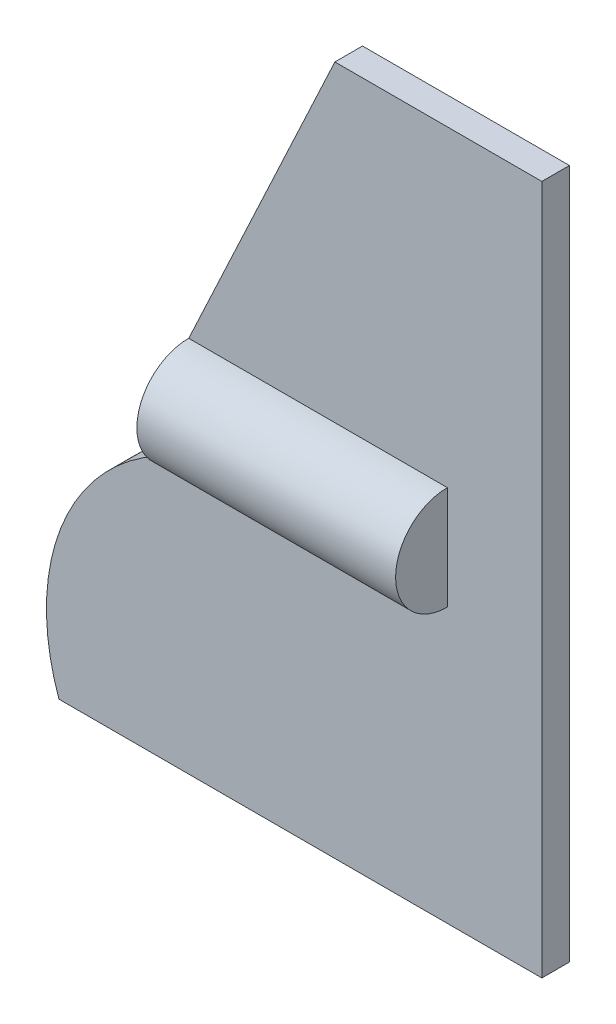
ISO-10303-21;
HEADER;
FILE_DESCRIPTION(('STEP AP214'),'2;1');
FILE_NAME('part.step','',(''),(''),'','','');
FILE_SCHEMA(('AUTOMOTIVE_DESIGN { 1 0 10303 214 1 1 1 1 }'));
ENDSEC;
DATA;
#1=APPLICATION_CONTEXT('core data for automotive mechanical design processes');
#2=APPLICATION_PROTOCOL_DEFINITION('international standard','automotive_design',2000,#1);
#3=PRODUCT_CONTEXT('',#1,'mechanical');
#4=PRODUCT('Part','Part','',(#3));
#5=PRODUCT_RELATED_PRODUCT_CATEGORY('part','',(#4));
#6=PRODUCT_DEFINITION_FORMATION('','',#4);
#7=PRODUCT_DEFINITION_CONTEXT('part definition',#1,'design');
#8=PRODUCT_DEFINITION('design','',#6,#7);
#9=PRODUCT_DEFINITION_SHAPE('','',#8);
#10=(LENGTH_UNIT() NAMED_UNIT(*) SI_UNIT(.MILLI.,.METRE.));
#11=(NAMED_UNIT(*) PLANE_ANGLE_UNIT() SI_UNIT($,.RADIAN.));
#12=(NAMED_UNIT(*) SI_UNIT($,.STERADIAN.) SOLID_ANGLE_UNIT());
#13=UNCERTAINTY_MEASURE_WITH_UNIT(LENGTH_MEASURE(1.E-05),#10,'distance_accuracy_value','');
#14=(GEOMETRIC_REPRESENTATION_CONTEXT(3) GLOBAL_UNCERTAINTY_ASSIGNED_CONTEXT((#13)) GLOBAL_UNIT_ASSIGNED_CONTEXT((#10,
#11,#12)) REPRESENTATION_CONTEXT('',''));
#15=CARTESIAN_POINT('',(0.,0.,0.));
#16=DIRECTION('',(0.,0.,1.));
#17=DIRECTION('',(1.,0.,0.));
#18=AXIS2_PLACEMENT_3D('',#15,#16,#17);
#19=CARTESIAN_POINT('',(56.3,54.7109107507036,4.));
#20=DIRECTION('',(0.,0.,1.));
#21=DIRECTION('',(1.,0.,0.));
#22=AXIS2_PLACEMENT_3D('',#19,#20,#21);
#23=PLANE('',#22);
#24=DIRECTION('',(-1.,0.,0.));
#25=VECTOR('',#24,1.);
#26=CARTESIAN_POINT('',(48.8,51.9164148444315,4.));
#27=LINE('',#26,#25);
#28=CARTESIAN_POINT('',(18.8,51.9164148444315,4.));
#29=VERTEX_POINT('',#28);
#30=CARTESIAN_POINT('',(18.8127775541657,51.9164148444315,4.));
#31=VERTEX_POINT('',#30);
#32=EDGE_CURVE('E118',#29,#31,#27,.F.);
#33=ORIENTED_EDGE('',*,*,#32,.F.);
#34=DIRECTION('',(0.,1.,0.));
#35=VECTOR('',#34,1.);
#36=CARTESIAN_POINT('',(18.8,54.7109107507036,4.));
#37=LINE('',#36,#35);
#38=CARTESIAN_POINT('',(18.8,54.7109107507036,4.));
#39=VERTEX_POINT('',#38);
#40=EDGE_CURVE('E130',#29,#39,#37,.T.);
#41=ORIENTED_EDGE('',*,*,#40,.T.);
#42=DIRECTION('',(-1.,0.,0.));
#43=VECTOR('',#42,1.);
#44=CARTESIAN_POINT('',(56.3,54.7109107507036,4.));
#45=LINE('',#44,#43);
#46=CARTESIAN_POINT('',(18.8127775541658,54.7109107507036,4.));
#47=VERTEX_POINT('',#46);
#48=EDGE_CURVE('E155',#47,#39,#45,.T.);
#49=ORIENTED_EDGE('',*,*,#48,.F.);
#50=DIRECTION('',(0.,-1.,0.));
#51=VECTOR('',#50,1.);
#52=CARTESIAN_POINT('',(18.8127775541658,54.7109107507036,4.));
#53=LINE('',#52,#51);
#54=EDGE_CURVE('E133',#47,#31,#53,.T.);
#55=ORIENTED_EDGE('',*,*,#54,.T.);
#56=EDGE_LOOP('',(#33,#41,#49,#55));
#57=FACE_BOUND('',#56,.T.);
#58=ADVANCED_FACE('F39',(#57),#23,.F.);
#59=DIRECTION('',(-1.,0.,0.));
#60=VECTOR('',#59,1.);
#61=CARTESIAN_POINT('',(48.8,42.5054066569756,4.));
#62=LINE('',#61,#60);
#63=CARTESIAN_POINT('',(18.8127775541657,42.5054066569756,4.));
#64=VERTEX_POINT('',#63);
#65=CARTESIAN_POINT('',(18.8,42.5054066569756,4.));
#66=VERTEX_POINT('',#65);
#67=EDGE_CURVE('E55',#64,#66,#62,.T.);
#68=ORIENTED_EDGE('',*,*,#67,.F.);
#69=CARTESIAN_POINT('',(18.8127775541657,39.7109107507036,4.));
#70=VERTEX_POINT('',#69);
#71=EDGE_CURVE('E177',#64,#70,#53,.T.);
#72=ORIENTED_EDGE('',*,*,#71,.T.);
#73=DIRECTION('',(-1.,0.,0.));
#74=VECTOR('',#73,1.);
#75=CARTESIAN_POINT('',(56.3,39.7109107507036,4.));
#76=LINE('',#75,#74);
#77=CARTESIAN_POINT('',(18.8,39.7109107507036,4.));
#78=VERTEX_POINT('',#77);
#79=EDGE_CURVE('E154',#70,#78,#76,.T.);
#80=ORIENTED_EDGE('',*,*,#79,.T.);
#81=EDGE_CURVE('E142',#78,#66,#37,.T.);
#82=ORIENTED_EDGE('',*,*,#81,.T.);
#83=EDGE_LOOP('',(#68,#72,#80,#82));
#84=FACE_BOUND('',#83,.T.);
#85=ADVANCED_FACE('F272',(#84),#23,.F.);
#86=CARTESIAN_POINT('',(29.2618441524348,10.4490665982689,4.));
#87=DIRECTION('',(0.,0.,1.));
#88=DIRECTION('',(1.,0.,0.));
#89=AXIS2_PLACEMENT_3D('',#86,#87,#88);
#90=PLANE('',#89);
#91=DIRECTION('',(-0.423744448916685,-0.905781784985928,0.));
#92=VECTOR('',#91,1.);
#93=CARTESIAN_POINT('',(40.,100.,4.));
#94=LINE('',#93,#92);
#95=CARTESIAN_POINT('',(40.,100.,4.));
#96=VERTEX_POINT('',#95);
#97=EDGE_CURVE('E174',#96,#47,#94,.T.);
#98=ORIENTED_EDGE('',*,*,#97,.T.);
#99=CARTESIAN_POINT('',(56.3,54.7109107507036,4.));
#100=VERTEX_POINT('',#99);
#101=EDGE_CURVE('E150',#100,#47,#45,.T.);
#102=ORIENTED_EDGE('',*,*,#101,.F.);
#103=DIRECTION('',(0.,1.,0.));
#104=VECTOR('',#103,1.);
#105=CARTESIAN_POINT('',(56.3,54.7109107507036,4.));
#106=LINE('',#105,#104);
#107=CARTESIAN_POINT('',(56.3,39.7109107507036,4.));
#108=VERTEX_POINT('',#107);
#109=EDGE_CURVE('E63',#108,#100,#106,.T.);
#110=ORIENTED_EDGE('',*,*,#109,.F.);
#111=EDGE_CURVE('E156',#108,#70,#76,.T.);
#112=ORIENTED_EDGE('',*,*,#111,.T.);
#113=CARTESIAN_POINT('',(29.2618441524348,10.4490665982689,4.));
#114=DIRECTION('',(0.,0.,1.));
#115=DIRECTION('',(1.,0.,0.));
#116=AXIS2_PLACEMENT_3D('',#113,#114,#115);
#117=CIRCLE('',#116,31.0715064967317);
#118=CARTESIAN_POINT('',(0.,0.,4.));
#119=VERTEX_POINT('',#118);
#120=EDGE_CURVE('E160',#70,#119,#117,.T.);
#121=ORIENTED_EDGE('',*,*,#120,.T.);
#122=DIRECTION('',(1.,0.,0.));
#123=VECTOR('',#122,1.);
#124=CARTESIAN_POINT('',(0.,0.,4.));
#125=LINE('',#124,#123);
#126=CARTESIAN_POINT('',(70.,0.,4.));
#127=VERTEX_POINT('',#126);
#128=EDGE_CURVE('E164',#119,#127,#125,.T.);
#129=ORIENTED_EDGE('',*,*,#128,.T.);
#130=DIRECTION('',(0.,1.,0.));
#131=VECTOR('',#130,1.);
#132=CARTESIAN_POINT('',(70.,0.,4.));
#133=LINE('',#132,#131);
#134=CARTESIAN_POINT('',(70.,100.,4.));
#135=VERTEX_POINT('',#134);
#136=EDGE_CURVE('E168',#127,#135,#133,.T.);
#137=ORIENTED_EDGE('',*,*,#136,.T.);
#138=DIRECTION('',(-1.,0.,0.));
#139=VECTOR('',#138,1.);
#140=CARTESIAN_POINT('',(70.,100.,4.));
#141=LINE('',#140,#139);
#142=EDGE_CURVE('E171',#135,#96,#141,.T.);
#143=ORIENTED_EDGE('',*,*,#142,.T.);
#144=EDGE_LOOP('',(#98,#102,#110,#112,#121,#129,#137,#143));
#145=FACE_BOUND('',#144,.T.);
#146=ADVANCED_FACE('F235',(#145),#90,.T.);
#147=CARTESIAN_POINT('',(29.2618441524348,10.4490665982689,4.));
#148=DIRECTION('',(0.,0.,-1.));
#149=DIRECTION('',(-1.,0.,0.));
#150=AXIS2_PLACEMENT_3D('',#147,#148,#149);
#151=CYLINDRICAL_SURFACE('',#150,31.0715064967317);
#152=CARTESIAN_POINT('',(29.2618441524348,10.4490665982689,0.));
#153=DIRECTION('',(0.,0.,1.));
#154=DIRECTION('',(1.,0.,0.));
#155=AXIS2_PLACEMENT_3D('',#152,#153,#154);
#156=CIRCLE('',#155,31.0715064967317);
#157=CARTESIAN_POINT('',(18.8127775541657,39.7109107507036,0.));
#158=VERTEX_POINT('',#157);
#159=CARTESIAN_POINT('',(0.,0.,0.));
#160=VERTEX_POINT('',#159);
#161=EDGE_CURVE('E159',#158,#160,#156,.T.);
#162=ORIENTED_EDGE('',*,*,#161,.T.);
#163=DIRECTION('',(0.,0.,-1.));
#164=VECTOR('',#163,1.);
#165=CARTESIAN_POINT('',(0.,0.,4.));
#166=LINE('',#165,#164);
#167=EDGE_CURVE('E11',#119,#160,#166,.T.);
#168=ORIENTED_EDGE('',*,*,#167,.F.);
#169=ORIENTED_EDGE('',*,*,#120,.F.);
#170=DIRECTION('',(0.,0.,-1.));
#171=VECTOR('',#170,1.);
#172=CARTESIAN_POINT('',(18.8127775541657,39.7109107507036,4.));
#173=LINE('',#172,#171);
#174=EDGE_CURVE('E180',#70,#158,#173,.T.);
#175=ORIENTED_EDGE('',*,*,#174,.T.);
#176=EDGE_LOOP('',(#162,#168,#169,#175));
#177=FACE_BOUND('',#176,.T.);
#178=ADVANCED_FACE('F41',(#177),#151,.T.);
#179=CARTESIAN_POINT('',(0.,0.,4.));
#180=DIRECTION('',(0.,1.,0.));
#181=DIRECTION('',(0.,0.,1.));
#182=AXIS2_PLACEMENT_3D('',#179,#180,#181);
#183=PLANE('',#182);
#184=DIRECTION('',(1.,0.,0.));
#185=VECTOR('',#184,1.);
#186=CARTESIAN_POINT('',(0.,0.,0.));
#187=LINE('',#186,#185);
#188=CARTESIAN_POINT('',(70.,0.,0.));
#189=VERTEX_POINT('',#188);
#190=EDGE_CURVE('E184',#160,#189,#187,.T.);
#191=ORIENTED_EDGE('',*,*,#190,.T.);
#192=DIRECTION('',(0.,0.,-1.));
#193=VECTOR('',#192,1.);
#194=CARTESIAN_POINT('',(70.,0.,4.));
#195=LINE('',#194,#193);
#196=EDGE_CURVE('E48',#127,#189,#195,.T.);
#197=ORIENTED_EDGE('',*,*,#196,.F.);
#198=ORIENTED_EDGE('',*,*,#128,.F.);
#199=ORIENTED_EDGE('',*,*,#167,.T.);
#200=EDGE_LOOP('',(#191,#197,#198,#199));
#201=FACE_BOUND('',#200,.T.);
#202=ADVANCED_FACE('F238',(#201),#183,.F.);
#203=CARTESIAN_POINT('',(70.,0.,4.));
#204=DIRECTION('',(-1.,0.,0.));
#205=DIRECTION('',(0.,0.,1.));
#206=AXIS2_PLACEMENT_3D('',#203,#204,#205);
#207=PLANE('',#206);
#208=DIRECTION('',(0.,1.,0.));
#209=VECTOR('',#208,1.);
#210=CARTESIAN_POINT('',(70.,0.,0.));
#211=LINE('',#210,#209);
#212=CARTESIAN_POINT('',(70.,100.,0.));
#213=VERTEX_POINT('',#212);
#214=EDGE_CURVE('E187',#189,#213,#211,.T.);
#215=ORIENTED_EDGE('',*,*,#214,.T.);
#216=DIRECTION('',(0.,0.,-1.));
#217=VECTOR('',#216,1.);
#218=CARTESIAN_POINT('',(70.,100.,4.));
#219=LINE('',#218,#217);
#220=EDGE_CURVE('E209',#135,#213,#219,.T.);
#221=ORIENTED_EDGE('',*,*,#220,.F.);
#222=ORIENTED_EDGE('',*,*,#136,.F.);
#223=ORIENTED_EDGE('',*,*,#196,.T.);
#224=EDGE_LOOP('',(#215,#221,#222,#223));
#225=FACE_BOUND('',#224,.T.);
#226=ADVANCED_FACE('F218',(#225),#207,.F.);
#227=CARTESIAN_POINT('',(70.,100.,4.));
#228=DIRECTION('',(0.,-1.,0.));
#229=DIRECTION('',(0.,0.,-1.));
#230=AXIS2_PLACEMENT_3D('',#227,#228,#229);
#231=PLANE('',#230);
#232=DIRECTION('',(-1.,0.,0.));
#233=VECTOR('',#232,1.);
#234=CARTESIAN_POINT('',(70.,100.,0.));
#235=LINE('',#234,#233);
#236=CARTESIAN_POINT('',(40.,100.,0.));
#237=VERTEX_POINT('',#236);
#238=EDGE_CURVE('E190',#213,#237,#235,.T.);
#239=ORIENTED_EDGE('',*,*,#238,.T.);
#240=DIRECTION('',(0.,0.,-1.));
#241=VECTOR('',#240,1.);
#242=CARTESIAN_POINT('',(40.,100.,4.));
#243=LINE('',#242,#241);
#244=EDGE_CURVE('E205',#96,#237,#243,.T.);
#245=ORIENTED_EDGE('',*,*,#244,.F.);
#246=ORIENTED_EDGE('',*,*,#142,.F.);
#247=ORIENTED_EDGE('',*,*,#220,.T.);
#248=EDGE_LOOP('',(#239,#245,#246,#247));
#249=FACE_BOUND('',#248,.T.);
#250=ADVANCED_FACE('F229',(#249),#231,.F.);
#251=CARTESIAN_POINT('',(40.,100.,4.));
#252=DIRECTION('',(0.905781784985929,-0.423744448916685,0.));
#253=DIRECTION('',(0.423744448916685,0.905781784985928,0.));
#254=AXIS2_PLACEMENT_3D('',#251,#252,#253);
#255=PLANE('',#254);
#256=DIRECTION('',(-0.423744448916685,-0.905781784985928,0.));
#257=VECTOR('',#256,1.);
#258=CARTESIAN_POINT('',(40.,100.,0.));
#259=LINE('',#258,#257);
#260=CARTESIAN_POINT('',(18.8127775541658,54.7109107507036,0.));
#261=VERTEX_POINT('',#260);
#262=EDGE_CURVE('E193',#237,#261,#259,.T.);
#263=ORIENTED_EDGE('',*,*,#262,.T.);
#264=DIRECTION('',(0.,0.,-1.));
#265=VECTOR('',#264,1.);
#266=CARTESIAN_POINT('',(18.8127775541658,54.7109107507036,4.));
#267=LINE('',#266,#265);
#268=EDGE_CURVE('E201',#47,#261,#267,.T.);
#269=ORIENTED_EDGE('',*,*,#268,.F.);
#270=ORIENTED_EDGE('',*,*,#97,.F.);
#271=ORIENTED_EDGE('',*,*,#244,.T.);
#272=EDGE_LOOP('',(#263,#269,#270,#271));
#273=FACE_BOUND('',#272,.T.);
#274=ADVANCED_FACE('F233',(#273),#255,.F.);
#275=CARTESIAN_POINT('',(18.8127775541658,54.7109107507036,4.));
#276=DIRECTION('',(1.,0.,0.));
#277=DIRECTION('',(0.,1.,0.));
#278=AXIS2_PLACEMENT_3D('',#275,#276,#277);
#279=PLANE('',#278);
#280=CARTESIAN_POINT('',(18.8127775541657,47.2109107507036,5.69063042203477));
#281=DIRECTION('',(1.,0.,0.));
#282=DIRECTION('',(0.,1.,0.));
#283=AXIS2_PLACEMENT_3D('',#280,#281,#282);
#284=CIRCLE('',#283,5.);
#285=EDGE_CURVE('E136',#31,#64,#284,.F.);
#286=ORIENTED_EDGE('',*,*,#285,.F.);
#287=ORIENTED_EDGE('',*,*,#54,.F.);
#288=ORIENTED_EDGE('',*,*,#268,.T.);
#289=DIRECTION('',(0.,-1.,0.));
#290=VECTOR('',#289,1.);
#291=CARTESIAN_POINT('',(18.8127775541658,54.7109107507036,0.));
#292=LINE('',#291,#290);
#293=EDGE_CURVE('E165',#261,#158,#292,.T.);
#294=ORIENTED_EDGE('',*,*,#293,.T.);
#295=ORIENTED_EDGE('',*,*,#174,.F.);
#296=ORIENTED_EDGE('',*,*,#71,.F.);
#297=EDGE_LOOP('',(#286,#287,#288,#294,#295,#296));
#298=FACE_BOUND('',#297,.T.);
#299=ADVANCED_FACE('F242',(#298),#279,.F.);
#300=CARTESIAN_POINT('',(29.2618441524348,10.4490665982689,0.));
#301=DIRECTION('',(0.,0.,1.));
#302=DIRECTION('',(1.,0.,0.));
#303=AXIS2_PLACEMENT_3D('',#300,#301,#302);
#304=PLANE('',#303);
#305=ORIENTED_EDGE('',*,*,#161,.F.);
#306=ORIENTED_EDGE('',*,*,#293,.F.);
#307=ORIENTED_EDGE('',*,*,#262,.F.);
#308=ORIENTED_EDGE('',*,*,#238,.F.);
#309=ORIENTED_EDGE('',*,*,#214,.F.);
#310=ORIENTED_EDGE('',*,*,#190,.F.);
#311=EDGE_LOOP('',(#305,#306,#307,#308,#309,#310));
#312=FACE_BOUND('',#311,.T.);
#313=ADVANCED_FACE('F224',(#312),#304,.F.);
#314=CARTESIAN_POINT('',(56.3,47.2109107507036,4.));
#315=DIRECTION('',(-1.,0.,0.));
#316=DIRECTION('',(0.,0.,1.));
#317=AXIS2_PLACEMENT_3D('',#314,#315,#316);
#318=CYLINDRICAL_SURFACE('',#317,7.49999999999999);
#319=CARTESIAN_POINT('',(18.8,47.2109107507036,4.));
#320=DIRECTION('',(1.,0.,0.));
#321=DIRECTION('',(0.,0.,-1.));
#322=AXIS2_PLACEMENT_3D('',#319,#320,#321);
#323=CIRCLE('',#322,7.49999999999999);
#324=EDGE_CURVE('E135',#39,#78,#323,.T.);
#325=ORIENTED_EDGE('',*,*,#324,.T.);
#326=ORIENTED_EDGE('',*,*,#79,.F.);
#327=ORIENTED_EDGE('',*,*,#111,.F.);
#328=CARTESIAN_POINT('',(56.3,47.2109107507036,4.));
#329=DIRECTION('',(1.,0.,0.));
#330=DIRECTION('',(0.,0.,-1.));
#331=AXIS2_PLACEMENT_3D('',#328,#329,#330);
#332=CIRCLE('',#331,7.49999999999999);
#333=EDGE_CURVE('E146',#100,#108,#332,.T.);
#334=ORIENTED_EDGE('',*,*,#333,.F.);
#335=ORIENTED_EDGE('',*,*,#101,.T.);
#336=ORIENTED_EDGE('',*,*,#48,.T.);
#337=EDGE_LOOP('',(#325,#326,#327,#334,#335,#336));
#338=FACE_BOUND('',#337,.T.);
#339=ADVANCED_FACE('F247',(#338),#318,.T.);
#340=CARTESIAN_POINT('',(56.3,47.2109107507036,4.));
#341=DIRECTION('',(1.,0.,0.));
#342=DIRECTION('',(0.,0.,-1.));
#343=AXIS2_PLACEMENT_3D('',#340,#341,#342);
#344=PLANE('',#343);
#345=ORIENTED_EDGE('',*,*,#333,.T.);
#346=ORIENTED_EDGE('',*,*,#109,.T.);
#347=EDGE_LOOP('',(#345,#346));
#348=FACE_BOUND('',#347,.T.);
#349=ADVANCED_FACE('F283',(#348),#344,.T.);
#350=CARTESIAN_POINT('',(18.8,47.2109107507036,4.));
#351=DIRECTION('',(1.,0.,0.));
#352=DIRECTION('',(0.,0.,-1.));
#353=AXIS2_PLACEMENT_3D('',#350,#351,#352);
#354=PLANE('',#353);
#355=CARTESIAN_POINT('',(18.8,47.2109107507036,5.69063042203477));
#356=DIRECTION('',(1.,0.,0.));
#357=DIRECTION('',(0.,0.,-1.));
#358=AXIS2_PLACEMENT_3D('',#355,#356,#357);
#359=CIRCLE('',#358,5.);
#360=EDGE_CURVE('E115',#29,#66,#359,.T.);
#361=ORIENTED_EDGE('',*,*,#360,.T.);
#362=ORIENTED_EDGE('',*,*,#81,.F.);
#363=ORIENTED_EDGE('',*,*,#324,.F.);
#364=ORIENTED_EDGE('',*,*,#40,.F.);
#365=EDGE_LOOP('',(#361,#362,#363,#364));
#366=FACE_BOUND('',#365,.T.);
#367=ADVANCED_FACE('F139',(#366),#354,.F.);
#368=CARTESIAN_POINT('',(48.8,47.2109107507036,5.69063042203477));
#369=DIRECTION('',(-1.,0.,0.));
#370=DIRECTION('',(0.,0.,1.));
#371=AXIS2_PLACEMENT_3D('',#368,#369,#370);
#372=CYLINDRICAL_SURFACE('',#371,5.);
#373=CARTESIAN_POINT('',(48.8,47.2109107507036,5.69063042203477));
#374=DIRECTION('',(1.,0.,0.));
#375=DIRECTION('',(0.,0.,-1.));
#376=AXIS2_PLACEMENT_3D('',#373,#374,#375);
#377=CIRCLE('',#376,5.);
#378=CARTESIAN_POINT('',(48.8,47.2109107507036,0.69063042203477));
#379=VERTEX_POINT('',#378);
#380=EDGE_CURVE('E125',#379,#379,#377,.T.);
#381=ORIENTED_EDGE('',*,*,#380,.T.);
#382=EDGE_LOOP('',(#381));
#383=FACE_BOUND('',#382,.T.);
#384=ORIENTED_EDGE('',*,*,#32,.T.);
#385=ORIENTED_EDGE('',*,*,#285,.T.);
#386=ORIENTED_EDGE('',*,*,#67,.T.);
#387=ORIENTED_EDGE('',*,*,#360,.F.);
#388=EDGE_LOOP('',(#384,#385,#386,#387));
#389=FACE_BOUND('',#388,.T.);
#390=ADVANCED_FACE('F117',(#383,#389),#372,.F.);
#391=CARTESIAN_POINT('',(48.8,47.2109107507036,5.69063042203477));
#392=DIRECTION('',(1.,0.,0.));
#393=DIRECTION('',(0.,0.,-1.));
#394=AXIS2_PLACEMENT_3D('',#391,#392,#393);
#395=PLANE('',#394);
#396=ORIENTED_EDGE('',*,*,#380,.F.);
#397=EDGE_LOOP('',(#396));
#398=FACE_BOUND('',#397,.T.);
#399=ADVANCED_FACE('F264',(#398),#395,.F.);
#400=CLOSED_SHELL('',(#58,#85,#146,#178,#202,#226,#250,#274,#299,#313,#339,#349,#367,#390,#399));
#401=MANIFOLD_SOLID_BREP('B2',#400);
#402=ADVANCED_BREP_SHAPE_REPRESENTATION('',(#18,#401),#14);
#403=SHAPE_DEFINITION_REPRESENTATION(#9,#402);
ENDSEC;
END-ISO-10303-21;
